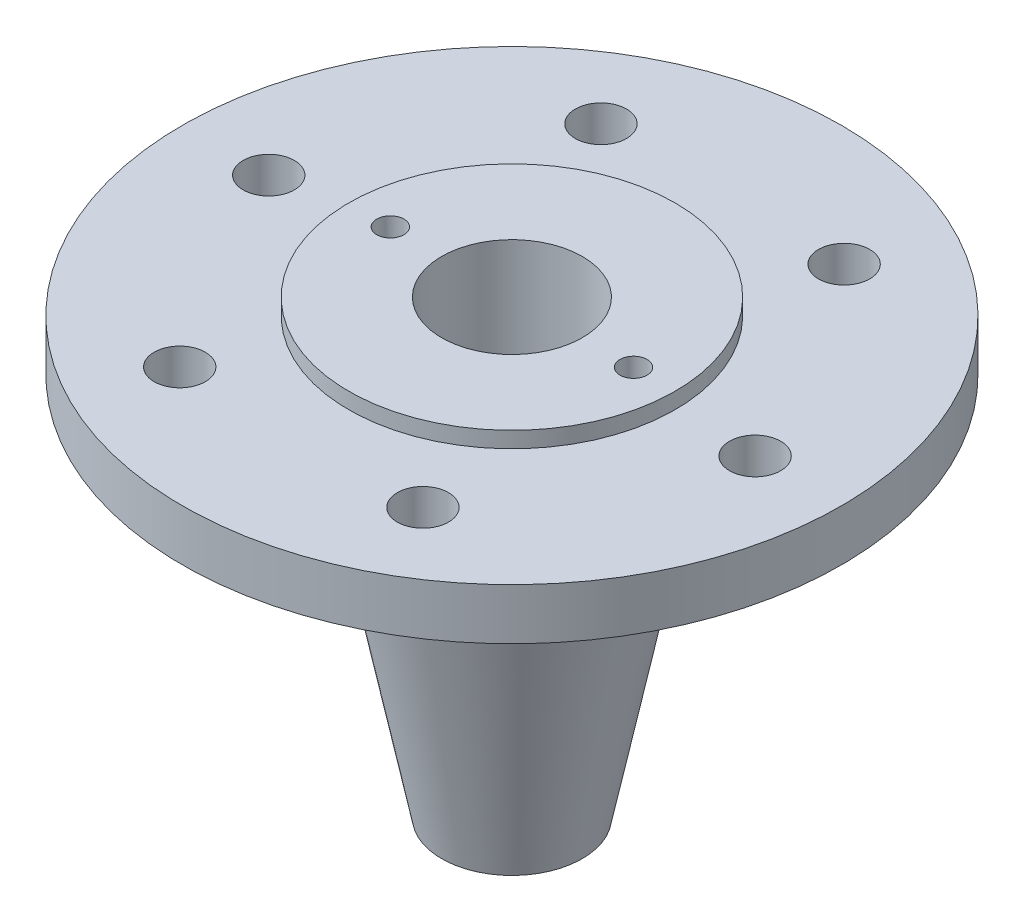
ISO-10303-21;
HEADER;
FILE_DESCRIPTION(('STEP AP214'),'2;1');
FILE_NAME('part.step','',(''),(''),'','','');
FILE_SCHEMA(('AUTOMOTIVE_DESIGN { 1 0 10303 214 1 1 1 1 }'));
ENDSEC;
DATA;
#1=APPLICATION_CONTEXT('core data for automotive mechanical design processes');
#2=APPLICATION_PROTOCOL_DEFINITION('international standard','automotive_design',2000,#1);
#3=PRODUCT_CONTEXT('',#1,'mechanical');
#4=PRODUCT('Part','Part','',(#3));
#5=PRODUCT_RELATED_PRODUCT_CATEGORY('part','',(#4));
#6=PRODUCT_DEFINITION_FORMATION('','',#4);
#7=PRODUCT_DEFINITION_CONTEXT('part definition',#1,'design');
#8=PRODUCT_DEFINITION('design','',#6,#7);
#9=PRODUCT_DEFINITION_SHAPE('','',#8);
#10=(LENGTH_UNIT() NAMED_UNIT(*) SI_UNIT(.MILLI.,.METRE.));
#11=(NAMED_UNIT(*) PLANE_ANGLE_UNIT() SI_UNIT($,.RADIAN.));
#12=(NAMED_UNIT(*) SI_UNIT($,.STERADIAN.) SOLID_ANGLE_UNIT());
#13=UNCERTAINTY_MEASURE_WITH_UNIT(LENGTH_MEASURE(1.E-05),#10,'distance_accuracy_value','');
#14=(GEOMETRIC_REPRESENTATION_CONTEXT(3) GLOBAL_UNCERTAINTY_ASSIGNED_CONTEXT((#13)) GLOBAL_UNIT_ASSIGNED_CONTEXT((#10,
#11,#12)) REPRESENTATION_CONTEXT('',''));
#15=CARTESIAN_POINT('',(0.,0.,0.));
#16=DIRECTION('',(0.,0.,1.));
#17=DIRECTION('',(1.,0.,0.));
#18=AXIS2_PLACEMENT_3D('',#15,#16,#17);
#19=CARTESIAN_POINT('',(0.,35.5744680851064,0.));
#20=DIRECTION('',(0.,1.,0.));
#21=DIRECTION('',(0.,0.,1.));
#22=AXIS2_PLACEMENT_3D('',#19,#20,#21);
#23=CONICAL_SURFACE('',#22,11.,1.06642162181694);
#24=CARTESIAN_POINT('',(0.,38.3344503561958,0.));
#25=DIRECTION('',(0.,-1.,0.));
#26=DIRECTION('',(0.,0.,-1.));
#27=AXIS2_PLACEMENT_3D('',#24,#25,#26);
#28=CIRCLE('',#27,16.);
#29=CARTESIAN_POINT('',(0.,38.3344503561958,-16.));
#30=VERTEX_POINT('',#29);
#31=EDGE_CURVE('E85',#30,#30,#28,.T.);
#32=ORIENTED_EDGE('',*,*,#31,.F.);
#33=EDGE_LOOP('',(#32));
#34=FACE_BOUND('',#33,.T.);
#35=CARTESIAN_POINT('',(0.,35.5744680851064,0.));
#36=DIRECTION('',(0.,-1.,0.));
#37=DIRECTION('',(0.,0.,-1.));
#38=AXIS2_PLACEMENT_3D('',#35,#36,#37);
#39=CIRCLE('',#38,11.);
#40=CARTESIAN_POINT('',(0.,35.5744680851064,-11.));
#41=VERTEX_POINT('',#40);
#42=EDGE_CURVE('E10',#41,#41,#39,.T.);
#43=ORIENTED_EDGE('',*,*,#42,.T.);
#44=EDGE_LOOP('',(#43));
#45=FACE_BOUND('',#44,.T.);
#46=ADVANCED_FACE('F33',(#34,#45),#23,.F.);
#47=CARTESIAN_POINT('',(0.,0.,0.));
#48=DIRECTION('',(0.,-1.,0.));
#49=DIRECTION('',(0.,0.,-1.));
#50=AXIS2_PLACEMENT_3D('',#47,#48,#49);
#51=CYLINDRICAL_SURFACE('',#50,11.);
#52=ORIENTED_EDGE('',*,*,#42,.F.);
#53=EDGE_LOOP('',(#52));
#54=FACE_BOUND('',#53,.T.);
#55=CARTESIAN_POINT('',(0.,0.,0.));
#56=DIRECTION('',(0.,-1.,0.));
#57=DIRECTION('',(0.,0.,-1.));
#58=AXIS2_PLACEMENT_3D('',#55,#56,#57);
#59=CIRCLE('',#58,11.);
#60=CARTESIAN_POINT('',(0.,0.,-11.));
#61=VERTEX_POINT('',#60);
#62=EDGE_CURVE('E39',#61,#61,#59,.T.);
#63=ORIENTED_EDGE('',*,*,#62,.T.);
#64=EDGE_LOOP('',(#63));
#65=FACE_BOUND('',#64,.T.);
#66=ADVANCED_FACE('F189',(#54,#65),#51,.F.);
#67=CARTESIAN_POINT('',(-22.,0.,0.));
#68=DIRECTION('',(0.,1.,0.));
#69=DIRECTION('',(0.,0.,1.));
#70=AXIS2_PLACEMENT_3D('',#67,#68,#69);
#71=PLANE('',#70);
#72=ORIENTED_EDGE('',*,*,#62,.F.);
#73=EDGE_LOOP('',(#72));
#74=FACE_BOUND('',#73,.T.);
#75=CARTESIAN_POINT('',(0.,0.,0.));
#76=DIRECTION('',(0.,-1.,0.));
#77=DIRECTION('',(0.,0.,-1.));
#78=AXIS2_PLACEMENT_3D('',#75,#76,#77);
#79=CIRCLE('',#78,22.);
#80=CARTESIAN_POINT('',(0.,0.,-22.));
#81=VERTEX_POINT('',#80);
#82=EDGE_CURVE('E43',#81,#81,#79,.T.);
#83=ORIENTED_EDGE('',*,*,#82,.T.);
#84=EDGE_LOOP('',(#83));
#85=FACE_BOUND('',#84,.T.);
#86=ADVANCED_FACE('F193',(#74,#85),#71,.F.);
#87=CARTESIAN_POINT('',(0.,110.,0.));
#88=DIRECTION('',(0.,1.,0.));
#89=DIRECTION('',(0.,0.,1.));
#90=AXIS2_PLACEMENT_3D('',#87,#88,#89);
#91=CONICAL_SURFACE('',#90,44.,0.197395559849881);
#92=ORIENTED_EDGE('',*,*,#82,.F.);
#93=EDGE_LOOP('',(#92));
#94=FACE_BOUND('',#93,.T.);
#95=CARTESIAN_POINT('',(0.,110.,0.));
#96=DIRECTION('',(0.,-1.,0.));
#97=DIRECTION('',(0.,0.,-1.));
#98=AXIS2_PLACEMENT_3D('',#95,#96,#97);
#99=CIRCLE('',#98,44.);
#100=CARTESIAN_POINT('',(0.,110.,-44.));
#101=VERTEX_POINT('',#100);
#102=EDGE_CURVE('E47',#101,#101,#99,.T.);
#103=ORIENTED_EDGE('',*,*,#102,.T.);
#104=EDGE_LOOP('',(#103));
#105=FACE_BOUND('',#104,.T.);
#106=ADVANCED_FACE('F198',(#94,#105),#91,.T.);
#107=CARTESIAN_POINT('',(-44.,110.,0.));
#108=DIRECTION('',(0.,1.,0.));
#109=DIRECTION('',(0.,0.,1.));
#110=AXIS2_PLACEMENT_3D('',#107,#108,#109);
#111=PLANE('',#110);
#112=ORIENTED_EDGE('',*,*,#102,.F.);
#113=EDGE_LOOP('',(#112));
#114=FACE_BOUND('',#113,.T.);
#115=CARTESIAN_POINT('',(0.,110.,0.));
#116=DIRECTION('',(0.,-1.,0.));
#117=DIRECTION('',(0.,0.,-1.));
#118=AXIS2_PLACEMENT_3D('',#115,#116,#117);
#119=CIRCLE('',#118,54.);
#120=CARTESIAN_POINT('',(0.,110.,-54.));
#121=VERTEX_POINT('',#120);
#122=EDGE_CURVE('E52',#121,#121,#119,.T.);
#123=ORIENTED_EDGE('',*,*,#122,.T.);
#124=EDGE_LOOP('',(#123));
#125=FACE_BOUND('',#124,.T.);
#126=ADVANCED_FACE('F204',(#114,#125),#111,.F.);
#127=CARTESIAN_POINT('',(0.,0.,0.));
#128=DIRECTION('',(0.,-1.,0.));
#129=DIRECTION('',(0.,0.,-1.));
#130=AXIS2_PLACEMENT_3D('',#127,#128,#129);
#131=CYLINDRICAL_SURFACE('',#130,54.);
#132=ORIENTED_EDGE('',*,*,#122,.F.);
#133=EDGE_LOOP('',(#132));
#134=FACE_BOUND('',#133,.T.);
#135=CARTESIAN_POINT('',(0.,120.,0.));
#136=DIRECTION('',(0.,-1.,0.));
#137=DIRECTION('',(0.,0.,-1.));
#138=AXIS2_PLACEMENT_3D('',#135,#136,#137);
#139=CIRCLE('',#138,54.);
#140=CARTESIAN_POINT('',(0.,120.,-54.));
#141=VERTEX_POINT('',#140);
#142=EDGE_CURVE('E55',#141,#141,#139,.T.);
#143=ORIENTED_EDGE('',*,*,#142,.T.);
#144=EDGE_LOOP('',(#143));
#145=FACE_BOUND('',#144,.T.);
#146=ADVANCED_FACE('F208',(#134,#145),#131,.T.);
#147=CARTESIAN_POINT('',(-103.,120.,0.));
#148=DIRECTION('',(0.,1.,0.));
#149=DIRECTION('',(0.,0.,1.));
#150=AXIS2_PLACEMENT_3D('',#147,#148,#149);
#151=PLANE('',#150);
#152=CARTESIAN_POINT('',(-38.0000000000008,120.,65.8179306876169));
#153=DIRECTION('',(0.,1.,0.));
#154=DIRECTION('',(0.,0.,1.));
#155=AXIS2_PLACEMENT_3D('',#152,#153,#154);
#156=CIRCLE('',#155,8.);
#157=CARTESIAN_POINT('',(-38.0000000000008,120.,73.8179306876169));
#158=VERTEX_POINT('',#157);
#159=EDGE_CURVE('E118',#158,#158,#156,.T.);
#160=ORIENTED_EDGE('',*,*,#159,.T.);
#161=EDGE_LOOP('',(#160));
#162=FACE_BOUND('',#161,.T.);
#163=CARTESIAN_POINT('',(37.9999999999994,120.,65.8179306876177));
#164=DIRECTION('',(0.,1.,0.));
#165=DIRECTION('',(0.,0.,1.));
#166=AXIS2_PLACEMENT_3D('',#163,#164,#165);
#167=CIRCLE('',#166,7.99999999999999);
#168=CARTESIAN_POINT('',(37.9999999999994,120.,73.8179306876177));
#169=VERTEX_POINT('',#168);
#170=EDGE_CURVE('E112',#169,#169,#167,.T.);
#171=ORIENTED_EDGE('',*,*,#170,.T.);
#172=EDGE_LOOP('',(#171));
#173=FACE_BOUND('',#172,.T.);
#174=CARTESIAN_POINT('',(76.,120.,5.30705163504156E-13));
#175=DIRECTION('',(0.,1.,0.));
#176=DIRECTION('',(0.,0.,1.));
#177=AXIS2_PLACEMENT_3D('',#174,#175,#176);
#178=CIRCLE('',#177,7.99999999999999);
#179=CARTESIAN_POINT('',(76.,120.,8.00000000000053));
#180=VERTEX_POINT('',#179);
#181=EDGE_CURVE('E106',#180,#180,#178,.T.);
#182=ORIENTED_EDGE('',*,*,#181,.T.);
#183=EDGE_LOOP('',(#182));
#184=FACE_BOUND('',#183,.T.);
#185=CARTESIAN_POINT('',(38.0000000000003,120.,-65.8179306876172));
#186=DIRECTION('',(0.,1.,0.));
#187=DIRECTION('',(0.,0.,1.));
#188=AXIS2_PLACEMENT_3D('',#185,#186,#187);
#189=CIRCLE('',#188,8.);
#190=CARTESIAN_POINT('',(38.0000000000003,120.,-57.8179306876172));
#191=VERTEX_POINT('',#190);
#192=EDGE_CURVE('E100',#191,#191,#189,.T.);
#193=ORIENTED_EDGE('',*,*,#192,.T.);
#194=EDGE_LOOP('',(#193));
#195=FACE_BOUND('',#194,.T.);
#196=CARTESIAN_POINT('',(-37.9999999999998,120.,-65.8179306876174));
#197=DIRECTION('',(0.,1.,0.));
#198=DIRECTION('',(0.,0.,1.));
#199=AXIS2_PLACEMENT_3D('',#196,#197,#198);
#200=CIRCLE('',#199,7.99999999999999);
#201=CARTESIAN_POINT('',(-37.9999999999998,120.,-57.8179306876174));
#202=VERTEX_POINT('',#201);
#203=EDGE_CURVE('E94',#202,#202,#200,.T.);
#204=ORIENTED_EDGE('',*,*,#203,.T.);
#205=EDGE_LOOP('',(#204));
#206=FACE_BOUND('',#205,.T.);
#207=CARTESIAN_POINT('',(-76.,120.,0.));
#208=DIRECTION('',(0.,1.,0.));
#209=DIRECTION('',(0.,0.,1.));
#210=AXIS2_PLACEMENT_3D('',#207,#208,#209);
#211=CIRCLE('',#210,8.);
#212=CARTESIAN_POINT('',(-76.,120.,8.));
#213=VERTEX_POINT('',#212);
#214=EDGE_CURVE('E88',#213,#213,#211,.T.);
#215=ORIENTED_EDGE('',*,*,#214,.T.);
#216=EDGE_LOOP('',(#215));
#217=FACE_BOUND('',#216,.T.);
#218=ORIENTED_EDGE('',*,*,#142,.F.);
#219=EDGE_LOOP('',(#218));
#220=FACE_BOUND('',#219,.T.);
#221=CARTESIAN_POINT('',(0.,120.,0.));
#222=DIRECTION('',(0.,-1.,0.));
#223=DIRECTION('',(0.,0.,-1.));
#224=AXIS2_PLACEMENT_3D('',#221,#222,#223);
#225=CIRCLE('',#224,103.);
#226=CARTESIAN_POINT('',(0.,120.,-103.));
#227=VERTEX_POINT('',#226);
#228=EDGE_CURVE('E58',#227,#227,#225,.T.);
#229=ORIENTED_EDGE('',*,*,#228,.T.);
#230=EDGE_LOOP('',(#229));
#231=FACE_BOUND('',#230,.T.);
#232=ADVANCED_FACE('F212',(#162,#173,#184,#195,#206,#217,#220,#231),#151,.F.);
#233=CARTESIAN_POINT('',(0.,0.,0.));
#234=DIRECTION('',(0.,-1.,0.));
#235=DIRECTION('',(0.,0.,-1.));
#236=AXIS2_PLACEMENT_3D('',#233,#234,#235);
#237=CYLINDRICAL_SURFACE('',#236,103.);
#238=ORIENTED_EDGE('',*,*,#228,.F.);
#239=EDGE_LOOP('',(#238));
#240=FACE_BOUND('',#239,.T.);
#241=CARTESIAN_POINT('',(0.,136.,0.));
#242=DIRECTION('',(0.,-1.,0.));
#243=DIRECTION('',(0.,0.,-1.));
#244=AXIS2_PLACEMENT_3D('',#241,#242,#243);
#245=CIRCLE('',#244,103.);
#246=CARTESIAN_POINT('',(0.,136.,-103.));
#247=VERTEX_POINT('',#246);
#248=EDGE_CURVE('E61',#247,#247,#245,.T.);
#249=ORIENTED_EDGE('',*,*,#248,.T.);
#250=EDGE_LOOP('',(#249));
#251=FACE_BOUND('',#250,.T.);
#252=ADVANCED_FACE('F216',(#240,#251),#237,.T.);
#253=CARTESIAN_POINT('',(-51.,136.,0.));
#254=DIRECTION('',(0.,-1.,0.));
#255=DIRECTION('',(0.,0.,-1.));
#256=AXIS2_PLACEMENT_3D('',#253,#254,#255);
#257=PLANE('',#256);
#258=CARTESIAN_POINT('',(-38.0000000000008,136.,65.8179306876169));
#259=DIRECTION('',(0.,1.,0.));
#260=DIRECTION('',(0.,0.,1.));
#261=AXIS2_PLACEMENT_3D('',#258,#259,#260);
#262=CIRCLE('',#261,8.);
#263=CARTESIAN_POINT('',(-38.0000000000008,136.,73.8179306876169));
#264=VERTEX_POINT('',#263);
#265=EDGE_CURVE('E121',#264,#264,#262,.T.);
#266=ORIENTED_EDGE('',*,*,#265,.F.);
#267=EDGE_LOOP('',(#266));
#268=FACE_BOUND('',#267,.T.);
#269=CARTESIAN_POINT('',(37.9999999999994,136.,65.8179306876177));
#270=DIRECTION('',(0.,1.,0.));
#271=DIRECTION('',(0.,0.,1.));
#272=AXIS2_PLACEMENT_3D('',#269,#270,#271);
#273=CIRCLE('',#272,7.99999999999999);
#274=CARTESIAN_POINT('',(37.9999999999994,136.,73.8179306876177));
#275=VERTEX_POINT('',#274);
#276=EDGE_CURVE('E115',#275,#275,#273,.T.);
#277=ORIENTED_EDGE('',*,*,#276,.F.);
#278=EDGE_LOOP('',(#277));
#279=FACE_BOUND('',#278,.T.);
#280=CARTESIAN_POINT('',(76.,136.,5.30705163504156E-13));
#281=DIRECTION('',(0.,1.,0.));
#282=DIRECTION('',(0.,0.,1.));
#283=AXIS2_PLACEMENT_3D('',#280,#281,#282);
#284=CIRCLE('',#283,7.99999999999999);
#285=CARTESIAN_POINT('',(76.,136.,8.00000000000053));
#286=VERTEX_POINT('',#285);
#287=EDGE_CURVE('E109',#286,#286,#284,.T.);
#288=ORIENTED_EDGE('',*,*,#287,.F.);
#289=EDGE_LOOP('',(#288));
#290=FACE_BOUND('',#289,.T.);
#291=CARTESIAN_POINT('',(38.0000000000003,136.,-65.8179306876172));
#292=DIRECTION('',(0.,1.,0.));
#293=DIRECTION('',(0.,0.,1.));
#294=AXIS2_PLACEMENT_3D('',#291,#292,#293);
#295=CIRCLE('',#294,8.);
#296=CARTESIAN_POINT('',(38.0000000000003,136.,-57.8179306876172));
#297=VERTEX_POINT('',#296);
#298=EDGE_CURVE('E103',#297,#297,#295,.T.);
#299=ORIENTED_EDGE('',*,*,#298,.F.);
#300=EDGE_LOOP('',(#299));
#301=FACE_BOUND('',#300,.T.);
#302=CARTESIAN_POINT('',(-37.9999999999998,136.,-65.8179306876174));
#303=DIRECTION('',(0.,1.,0.));
#304=DIRECTION('',(0.,0.,1.));
#305=AXIS2_PLACEMENT_3D('',#302,#303,#304);
#306=CIRCLE('',#305,7.99999999999999);
#307=CARTESIAN_POINT('',(-37.9999999999998,136.,-57.8179306876174));
#308=VERTEX_POINT('',#307);
#309=EDGE_CURVE('E97',#308,#308,#306,.T.);
#310=ORIENTED_EDGE('',*,*,#309,.F.);
#311=EDGE_LOOP('',(#310));
#312=FACE_BOUND('',#311,.T.);
#313=CARTESIAN_POINT('',(-76.,136.,0.));
#314=DIRECTION('',(0.,1.,0.));
#315=DIRECTION('',(0.,0.,1.));
#316=AXIS2_PLACEMENT_3D('',#313,#314,#315);
#317=CIRCLE('',#316,8.);
#318=CARTESIAN_POINT('',(-76.,136.,8.));
#319=VERTEX_POINT('',#318);
#320=EDGE_CURVE('E91',#319,#319,#317,.T.);
#321=ORIENTED_EDGE('',*,*,#320,.F.);
#322=EDGE_LOOP('',(#321));
#323=FACE_BOUND('',#322,.T.);
#324=ORIENTED_EDGE('',*,*,#248,.F.);
#325=EDGE_LOOP('',(#324));
#326=FACE_BOUND('',#325,.T.);
#327=CARTESIAN_POINT('',(0.,136.,0.));
#328=DIRECTION('',(0.,-1.,0.));
#329=DIRECTION('',(0.,0.,-1.));
#330=AXIS2_PLACEMENT_3D('',#327,#328,#329);
#331=CIRCLE('',#330,51.);
#332=CARTESIAN_POINT('',(0.,136.,-51.));
#333=VERTEX_POINT('',#332);
#334=EDGE_CURVE('E64',#333,#333,#331,.T.);
#335=ORIENTED_EDGE('',*,*,#334,.T.);
#336=EDGE_LOOP('',(#335));
#337=FACE_BOUND('',#336,.T.);
#338=ADVANCED_FACE('F220',(#268,#279,#290,#301,#312,#323,#326,#337),#257,.F.);
#339=CARTESIAN_POINT('',(0.,0.,0.));
#340=DIRECTION('',(0.,-1.,0.));
#341=DIRECTION('',(0.,0.,-1.));
#342=AXIS2_PLACEMENT_3D('',#339,#340,#341);
#343=CYLINDRICAL_SURFACE('',#342,51.);
#344=ORIENTED_EDGE('',*,*,#334,.F.);
#345=EDGE_LOOP('',(#344));
#346=FACE_BOUND('',#345,.T.);
#347=CARTESIAN_POINT('',(0.,141.,0.));
#348=DIRECTION('',(0.,-1.,0.));
#349=DIRECTION('',(0.,0.,-1.));
#350=AXIS2_PLACEMENT_3D('',#347,#348,#349);
#351=CIRCLE('',#350,51.);
#352=CARTESIAN_POINT('',(0.,141.,-51.));
#353=VERTEX_POINT('',#352);
#354=EDGE_CURVE('E67',#353,#353,#351,.T.);
#355=ORIENTED_EDGE('',*,*,#354,.T.);
#356=EDGE_LOOP('',(#355));
#357=FACE_BOUND('',#356,.T.);
#358=ADVANCED_FACE('F150',(#346,#357),#343,.T.);
#359=CARTESIAN_POINT('',(-22.,141.,0.));
#360=DIRECTION('',(0.,-1.,0.));
#361=DIRECTION('',(0.,0.,-1.));
#362=AXIS2_PLACEMENT_3D('',#359,#360,#361);
#363=PLANE('',#362);
#364=CARTESIAN_POINT('',(38.,141.,0.));
#365=DIRECTION('',(0.,1.,0.));
#366=DIRECTION('',(0.,0.,1.));
#367=AXIS2_PLACEMENT_3D('',#364,#365,#366);
#368=CIRCLE('',#367,4.25);
#369=CARTESIAN_POINT('',(38.,141.,4.25));
#370=VERTEX_POINT('',#369);
#371=EDGE_CURVE('E131',#370,#370,#368,.T.);
#372=ORIENTED_EDGE('',*,*,#371,.F.);
#373=EDGE_LOOP('',(#372));
#374=FACE_BOUND('',#373,.T.);
#375=CARTESIAN_POINT('',(-38.,141.,0.));
#376=DIRECTION('',(0.,1.,0.));
#377=DIRECTION('',(0.,0.,1.));
#378=AXIS2_PLACEMENT_3D('',#375,#376,#377);
#379=CIRCLE('',#378,4.25);
#380=CARTESIAN_POINT('',(-38.,141.,4.25));
#381=VERTEX_POINT('',#380);
#382=EDGE_CURVE('E125',#381,#381,#379,.T.);
#383=ORIENTED_EDGE('',*,*,#382,.F.);
#384=EDGE_LOOP('',(#383));
#385=FACE_BOUND('',#384,.T.);
#386=ORIENTED_EDGE('',*,*,#354,.F.);
#387=EDGE_LOOP('',(#386));
#388=FACE_BOUND('',#387,.T.);
#389=CARTESIAN_POINT('',(0.,141.,0.));
#390=DIRECTION('',(0.,-1.,0.));
#391=DIRECTION('',(0.,0.,-1.));
#392=AXIS2_PLACEMENT_3D('',#389,#390,#391);
#393=CIRCLE('',#392,22.);
#394=CARTESIAN_POINT('',(0.,141.,-22.));
#395=VERTEX_POINT('',#394);
#396=EDGE_CURVE('E70',#395,#395,#393,.T.);
#397=ORIENTED_EDGE('',*,*,#396,.T.);
#398=EDGE_LOOP('',(#397));
#399=FACE_BOUND('',#398,.T.);
#400=ADVANCED_FACE('F146',(#374,#385,#388,#399),#363,.F.);
#401=CARTESIAN_POINT('',(0.,0.,0.));
#402=DIRECTION('',(0.,-1.,0.));
#403=DIRECTION('',(0.,0.,-1.));
#404=AXIS2_PLACEMENT_3D('',#401,#402,#403);
#405=CYLINDRICAL_SURFACE('',#404,22.);
#406=ORIENTED_EDGE('',*,*,#396,.F.);
#407=EDGE_LOOP('',(#406));
#408=FACE_BOUND('',#407,.T.);
#409=CARTESIAN_POINT('',(0.,97.,0.));
#410=DIRECTION('',(0.,-1.,0.));
#411=DIRECTION('',(0.,0.,-1.));
#412=AXIS2_PLACEMENT_3D('',#409,#410,#411);
#413=CIRCLE('',#412,22.);
#414=CARTESIAN_POINT('',(0.,97.,-22.));
#415=VERTEX_POINT('',#414);
#416=EDGE_CURVE('E73',#415,#415,#413,.T.);
#417=ORIENTED_EDGE('',*,*,#416,.T.);
#418=EDGE_LOOP('',(#417));
#419=FACE_BOUND('',#418,.T.);
#420=ADVANCED_FACE('F149',(#408,#419),#405,.F.);
#421=CARTESIAN_POINT('',(0.,89.8565164748273,0.));
#422=DIRECTION('',(0.,1.,0.));
#423=DIRECTION('',(0.,0.,1.));
#424=AXIS2_PLACEMENT_3D('',#421,#422,#423);
#425=CONICAL_SURFACE('',#424,11.,0.994837673636766);
#426=ORIENTED_EDGE('',*,*,#416,.F.);
#427=EDGE_LOOP('',(#426));
#428=FACE_BOUND('',#427,.T.);
#429=CARTESIAN_POINT('',(0.,89.8565164748273,0.));
#430=DIRECTION('',(0.,-1.,0.));
#431=DIRECTION('',(0.,0.,-1.));
#432=AXIS2_PLACEMENT_3D('',#429,#430,#431);
#433=CIRCLE('',#432,11.);
#434=CARTESIAN_POINT('',(0.,89.8565164748273,-11.));
#435=VERTEX_POINT('',#434);
#436=EDGE_CURVE('E76',#435,#435,#433,.T.);
#437=ORIENTED_EDGE('',*,*,#436,.T.);
#438=EDGE_LOOP('',(#437));
#439=FACE_BOUND('',#438,.T.);
#440=ADVANCED_FACE('F160',(#428,#439),#425,.F.);
#441=CARTESIAN_POINT('',(0.,0.,0.));
#442=DIRECTION('',(0.,-1.,0.));
#443=DIRECTION('',(0.,0.,-1.));
#444=AXIS2_PLACEMENT_3D('',#441,#442,#443);
#445=CYLINDRICAL_SURFACE('',#444,11.);
#446=ORIENTED_EDGE('',*,*,#436,.F.);
#447=EDGE_LOOP('',(#446));
#448=FACE_BOUND('',#447,.T.);
#449=CARTESIAN_POINT('',(0.,55.5744680851064,0.));
#450=DIRECTION('',(0.,-1.,0.));
#451=DIRECTION('',(0.,0.,-1.));
#452=AXIS2_PLACEMENT_3D('',#449,#450,#451);
#453=CIRCLE('',#452,11.);
#454=CARTESIAN_POINT('',(0.,55.5744680851064,-11.));
#455=VERTEX_POINT('',#454);
#456=EDGE_CURVE('E79',#455,#455,#453,.T.);
#457=ORIENTED_EDGE('',*,*,#456,.T.);
#458=EDGE_LOOP('',(#457));
#459=FACE_BOUND('',#458,.T.);
#460=ADVANCED_FACE('F166',(#448,#459),#445,.F.);
#461=CARTESIAN_POINT('',(0.,52.5745339832231,0.));
#462=DIRECTION('',(0.,-1.,0.));
#463=DIRECTION('',(0.,0.,-1.));
#464=AXIS2_PLACEMENT_3D('',#461,#462,#463);
#465=CONICAL_SURFACE('',#464,16.,1.03038651748018);
#466=ORIENTED_EDGE('',*,*,#456,.F.);
#467=EDGE_LOOP('',(#466));
#468=FACE_BOUND('',#467,.T.);
#469=CARTESIAN_POINT('',(0.,52.5745339832231,0.));
#470=DIRECTION('',(0.,-1.,0.));
#471=DIRECTION('',(0.,0.,-1.));
#472=AXIS2_PLACEMENT_3D('',#469,#470,#471);
#473=CIRCLE('',#472,16.);
#474=CARTESIAN_POINT('',(0.,52.5745339832231,-16.));
#475=VERTEX_POINT('',#474);
#476=EDGE_CURVE('E82',#475,#475,#473,.T.);
#477=ORIENTED_EDGE('',*,*,#476,.T.);
#478=EDGE_LOOP('',(#477));
#479=FACE_BOUND('',#478,.T.);
#480=ADVANCED_FACE('F172',(#468,#479),#465,.F.);
#481=CARTESIAN_POINT('',(0.,0.,0.));
#482=DIRECTION('',(0.,-1.,0.));
#483=DIRECTION('',(0.,0.,-1.));
#484=AXIS2_PLACEMENT_3D('',#481,#482,#483);
#485=CYLINDRICAL_SURFACE('',#484,16.);
#486=ORIENTED_EDGE('',*,*,#476,.F.);
#487=EDGE_LOOP('',(#486));
#488=FACE_BOUND('',#487,.T.);
#489=ORIENTED_EDGE('',*,*,#31,.T.);
#490=EDGE_LOOP('',(#489));
#491=FACE_BOUND('',#490,.T.);
#492=ADVANCED_FACE('F178',(#488,#491),#485,.F.);
#493=CARTESIAN_POINT('',(-76.,0.,0.));
#494=DIRECTION('',(0.,1.,0.));
#495=DIRECTION('',(0.,0.,1.));
#496=AXIS2_PLACEMENT_3D('',#493,#494,#495);
#497=CYLINDRICAL_SURFACE('',#496,8.);
#498=ORIENTED_EDGE('',*,*,#320,.T.);
#499=EDGE_LOOP('',(#498));
#500=FACE_BOUND('',#499,.T.);
#501=ORIENTED_EDGE('',*,*,#214,.F.);
#502=EDGE_LOOP('',(#501));
#503=FACE_BOUND('',#502,.T.);
#504=ADVANCED_FACE('F184',(#500,#503),#497,.F.);
#505=CARTESIAN_POINT('',(-37.9999999999998,0.,-65.8179306876174));
#506=DIRECTION('',(0.,1.,0.));
#507=DIRECTION('',(0.,0.,1.));
#508=AXIS2_PLACEMENT_3D('',#505,#506,#507);
#509=CYLINDRICAL_SURFACE('',#508,7.99999999999999);
#510=ORIENTED_EDGE('',*,*,#309,.T.);
#511=EDGE_LOOP('',(#510));
#512=FACE_BOUND('',#511,.T.);
#513=ORIENTED_EDGE('',*,*,#203,.F.);
#514=EDGE_LOOP('',(#513));
#515=FACE_BOUND('',#514,.T.);
#516=ADVANCED_FACE('F230',(#512,#515),#509,.F.);
#517=CARTESIAN_POINT('',(38.0000000000003,0.,-65.8179306876172));
#518=DIRECTION('',(0.,1.,0.));
#519=DIRECTION('',(0.,0.,1.));
#520=AXIS2_PLACEMENT_3D('',#517,#518,#519);
#521=CYLINDRICAL_SURFACE('',#520,8.);
#522=ORIENTED_EDGE('',*,*,#298,.T.);
#523=EDGE_LOOP('',(#522));
#524=FACE_BOUND('',#523,.T.);
#525=ORIENTED_EDGE('',*,*,#192,.F.);
#526=EDGE_LOOP('',(#525));
#527=FACE_BOUND('',#526,.T.);
#528=ADVANCED_FACE('F234',(#524,#527),#521,.F.);
#529=CARTESIAN_POINT('',(76.,0.,5.30705163504156E-13));
#530=DIRECTION('',(0.,1.,0.));
#531=DIRECTION('',(0.,0.,1.));
#532=AXIS2_PLACEMENT_3D('',#529,#530,#531);
#533=CYLINDRICAL_SURFACE('',#532,7.99999999999999);
#534=ORIENTED_EDGE('',*,*,#287,.T.);
#535=EDGE_LOOP('',(#534));
#536=FACE_BOUND('',#535,.T.);
#537=ORIENTED_EDGE('',*,*,#181,.F.);
#538=EDGE_LOOP('',(#537));
#539=FACE_BOUND('',#538,.T.);
#540=ADVANCED_FACE('F238',(#536,#539),#533,.F.);
#541=CARTESIAN_POINT('',(37.9999999999994,0.,65.8179306876177));
#542=DIRECTION('',(0.,1.,0.));
#543=DIRECTION('',(0.,0.,1.));
#544=AXIS2_PLACEMENT_3D('',#541,#542,#543);
#545=CYLINDRICAL_SURFACE('',#544,7.99999999999999);
#546=ORIENTED_EDGE('',*,*,#276,.T.);
#547=EDGE_LOOP('',(#546));
#548=FACE_BOUND('',#547,.T.);
#549=ORIENTED_EDGE('',*,*,#170,.F.);
#550=EDGE_LOOP('',(#549));
#551=FACE_BOUND('',#550,.T.);
#552=ADVANCED_FACE('F242',(#548,#551),#545,.F.);
#553=CARTESIAN_POINT('',(-38.0000000000008,0.,65.8179306876169));
#554=DIRECTION('',(0.,1.,0.));
#555=DIRECTION('',(0.,0.,1.));
#556=AXIS2_PLACEMENT_3D('',#553,#554,#555);
#557=CYLINDRICAL_SURFACE('',#556,8.);
#558=ORIENTED_EDGE('',*,*,#265,.T.);
#559=EDGE_LOOP('',(#558));
#560=FACE_BOUND('',#559,.T.);
#561=ORIENTED_EDGE('',*,*,#159,.F.);
#562=EDGE_LOOP('',(#561));
#563=FACE_BOUND('',#562,.T.);
#564=ADVANCED_FACE('F246',(#560,#563),#557,.F.);
#565=CARTESIAN_POINT('',(-38.,123.,0.));
#566=DIRECTION('',(0.,1.,0.));
#567=DIRECTION('',(0.,0.,1.));
#568=AXIS2_PLACEMENT_3D('',#565,#566,#567);
#569=CYLINDRICAL_SURFACE('',#568,4.25);
#570=CARTESIAN_POINT('',(-38.,123.,0.));
#571=DIRECTION('',(0.,1.,0.));
#572=DIRECTION('',(0.,0.,1.));
#573=AXIS2_PLACEMENT_3D('',#570,#571,#572);
#574=CIRCLE('',#573,4.25);
#575=CARTESIAN_POINT('',(-38.,123.,4.25));
#576=VERTEX_POINT('',#575);
#577=EDGE_CURVE('E124',#576,#576,#574,.T.);
#578=ORIENTED_EDGE('',*,*,#577,.F.);
#579=EDGE_LOOP('',(#578));
#580=FACE_BOUND('',#579,.T.);
#581=ORIENTED_EDGE('',*,*,#382,.T.);
#582=EDGE_LOOP('',(#581));
#583=FACE_BOUND('',#582,.T.);
#584=ADVANCED_FACE('F250',(#580,#583),#569,.F.);
#585=CARTESIAN_POINT('',(-38.,123.,0.));
#586=DIRECTION('',(0.,1.,0.));
#587=DIRECTION('',(0.,0.,1.));
#588=AXIS2_PLACEMENT_3D('',#585,#586,#587);
#589=PLANE('',#588);
#590=ORIENTED_EDGE('',*,*,#577,.T.);
#591=EDGE_LOOP('',(#590));
#592=FACE_BOUND('',#591,.T.);
#593=ADVANCED_FACE('F142',(#592),#589,.T.);
#594=CARTESIAN_POINT('',(38.,123.,0.));
#595=DIRECTION('',(0.,1.,0.));
#596=DIRECTION('',(0.,0.,1.));
#597=AXIS2_PLACEMENT_3D('',#594,#595,#596);
#598=CYLINDRICAL_SURFACE('',#597,4.25);
#599=CARTESIAN_POINT('',(38.,123.,0.));
#600=DIRECTION('',(0.,1.,0.));
#601=DIRECTION('',(0.,0.,1.));
#602=AXIS2_PLACEMENT_3D('',#599,#600,#601);
#603=CIRCLE('',#602,4.25);
#604=CARTESIAN_POINT('',(38.,123.,4.25));
#605=VERTEX_POINT('',#604);
#606=EDGE_CURVE('E128',#605,#605,#603,.T.);
#607=ORIENTED_EDGE('',*,*,#606,.F.);
#608=EDGE_LOOP('',(#607));
#609=FACE_BOUND('',#608,.T.);
#610=ORIENTED_EDGE('',*,*,#371,.T.);
#611=EDGE_LOOP('',(#610));
#612=FACE_BOUND('',#611,.T.);
#613=ADVANCED_FACE('F139',(#609,#612),#598,.F.);
#614=CARTESIAN_POINT('',(38.,123.,0.));
#615=DIRECTION('',(0.,1.,0.));
#616=DIRECTION('',(0.,0.,1.));
#617=AXIS2_PLACEMENT_3D('',#614,#615,#616);
#618=PLANE('',#617);
#619=ORIENTED_EDGE('',*,*,#606,.T.);
#620=EDGE_LOOP('',(#619));
#621=FACE_BOUND('',#620,.T.);
#622=ADVANCED_FACE('F137',(#621),#618,.T.);
#623=CLOSED_SHELL('',(#46,#66,#86,#106,#126,#146,#232,#252,#338,#358,#400,#420,#440,#460,#480,
#492,#504,#516,#528,#540,#552,#564,#584,#593,#613,#622));
#624=MANIFOLD_SOLID_BREP('B2',#623);
#625=ADVANCED_BREP_SHAPE_REPRESENTATION('',(#18,#624),#14);
#626=SHAPE_DEFINITION_REPRESENTATION(#9,#625);
ENDSEC;
END-ISO-10303-21;
